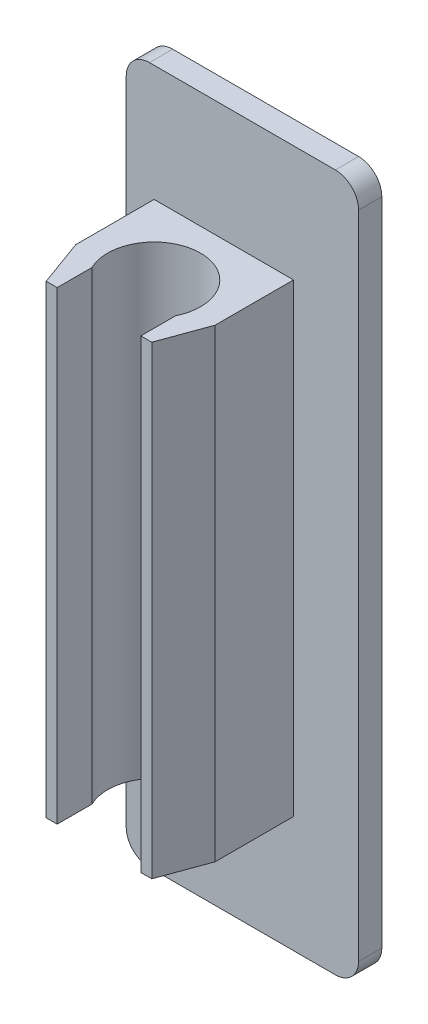
ISO-10303-21;
HEADER;
FILE_DESCRIPTION(('STEP AP214'),'2;1');
FILE_NAME('part.step','',(''),(''),'','','');
FILE_SCHEMA(('AUTOMOTIVE_DESIGN { 1 0 10303 214 1 1 1 1 }'));
ENDSEC;
DATA;
#1=APPLICATION_CONTEXT('core data for automotive mechanical design processes');
#2=APPLICATION_PROTOCOL_DEFINITION('international standard','automotive_design',2000,#1);
#3=PRODUCT_CONTEXT('',#1,'mechanical');
#4=PRODUCT('Part','Part','',(#3));
#5=PRODUCT_RELATED_PRODUCT_CATEGORY('part','',(#4));
#6=PRODUCT_DEFINITION_FORMATION('','',#4);
#7=PRODUCT_DEFINITION_CONTEXT('part definition',#1,'design');
#8=PRODUCT_DEFINITION('design','',#6,#7);
#9=PRODUCT_DEFINITION_SHAPE('','',#8);
#10=(LENGTH_UNIT() NAMED_UNIT(*) SI_UNIT(.MILLI.,.METRE.));
#11=(NAMED_UNIT(*) PLANE_ANGLE_UNIT() SI_UNIT($,.RADIAN.));
#12=(NAMED_UNIT(*) SI_UNIT($,.STERADIAN.) SOLID_ANGLE_UNIT());
#13=UNCERTAINTY_MEASURE_WITH_UNIT(LENGTH_MEASURE(1.E-05),#10,'distance_accuracy_value','');
#14=(GEOMETRIC_REPRESENTATION_CONTEXT(3) GLOBAL_UNCERTAINTY_ASSIGNED_CONTEXT((#13)) GLOBAL_UNIT_ASSIGNED_CONTEXT((#10,
#11,#12)) REPRESENTATION_CONTEXT('',''));
#15=CARTESIAN_POINT('',(0.,0.,0.));
#16=DIRECTION('',(0.,0.,1.));
#17=DIRECTION('',(1.,0.,0.));
#18=AXIS2_PLACEMENT_3D('',#15,#16,#17);
#19=CARTESIAN_POINT('',(0.,0.,1.));
#20=DIRECTION('',(0.,0.,1.));
#21=DIRECTION('',(1.,0.,0.));
#22=AXIS2_PLACEMENT_3D('',#19,#20,#21);
#23=PLANE('',#22);
#24=DIRECTION('',(0.,1.,0.));
#25=VECTOR('',#24,1.);
#26=CARTESIAN_POINT('',(5.,-15.,1.));
#27=LINE('',#26,#25);
#28=CARTESIAN_POINT('',(5.,-14.,1.));
#29=VERTEX_POINT('',#28);
#30=CARTESIAN_POINT('',(5.,14.,1.));
#31=VERTEX_POINT('',#30);
#32=EDGE_CURVE('E204',#29,#31,#27,.T.);
#33=ORIENTED_EDGE('',*,*,#32,.T.);
#34=CARTESIAN_POINT('',(4.,14.,1.));
#35=DIRECTION('',(0.,0.,1.));
#36=DIRECTION('',(1.,0.,0.));
#37=AXIS2_PLACEMENT_3D('',#34,#35,#36);
#38=CIRCLE('',#37,1.);
#39=CARTESIAN_POINT('',(4.,15.,1.));
#40=VERTEX_POINT('',#39);
#41=EDGE_CURVE('E239',#31,#40,#38,.T.);
#42=ORIENTED_EDGE('',*,*,#41,.T.);
#43=DIRECTION('',(-1.,0.,0.));
#44=VECTOR('',#43,1.);
#45=CARTESIAN_POINT('',(5.,15.,1.));
#46=LINE('',#45,#44);
#47=CARTESIAN_POINT('',(-4.,15.,1.));
#48=VERTEX_POINT('',#47);
#49=EDGE_CURVE('E207',#40,#48,#46,.T.);
#50=ORIENTED_EDGE('',*,*,#49,.T.);
#51=CARTESIAN_POINT('',(-4.,14.,1.));
#52=DIRECTION('',(0.,0.,1.));
#53=DIRECTION('',(1.,0.,0.));
#54=AXIS2_PLACEMENT_3D('',#51,#52,#53);
#55=CIRCLE('',#54,1.);
#56=CARTESIAN_POINT('',(-5.,14.,1.));
#57=VERTEX_POINT('',#56);
#58=EDGE_CURVE('E235',#48,#57,#55,.T.);
#59=ORIENTED_EDGE('',*,*,#58,.T.);
#60=DIRECTION('',(0.,-1.,0.));
#61=VECTOR('',#60,1.);
#62=CARTESIAN_POINT('',(-5.,-15.,1.));
#63=LINE('',#62,#61);
#64=CARTESIAN_POINT('',(-5.,-14.,1.));
#65=VERTEX_POINT('',#64);
#66=EDGE_CURVE('E199',#57,#65,#63,.T.);
#67=ORIENTED_EDGE('',*,*,#66,.T.);
#68=CARTESIAN_POINT('',(-4.,-14.,1.));
#69=DIRECTION('',(0.,0.,1.));
#70=DIRECTION('',(1.,0.,0.));
#71=AXIS2_PLACEMENT_3D('',#68,#69,#70);
#72=CIRCLE('',#71,1.);
#73=CARTESIAN_POINT('',(-4.,-15.,1.));
#74=VERTEX_POINT('',#73);
#75=EDGE_CURVE('E59',#65,#74,#72,.T.);
#76=ORIENTED_EDGE('',*,*,#75,.T.);
#77=DIRECTION('',(1.,0.,0.));
#78=VECTOR('',#77,1.);
#79=CARTESIAN_POINT('',(5.,-15.,1.));
#80=LINE('',#79,#78);
#81=CARTESIAN_POINT('',(4.,-15.,1.));
#82=VERTEX_POINT('',#81);
#83=EDGE_CURVE('E201',#74,#82,#80,.T.);
#84=ORIENTED_EDGE('',*,*,#83,.T.);
#85=CARTESIAN_POINT('',(4.,-14.,1.));
#86=DIRECTION('',(0.,0.,1.));
#87=DIRECTION('',(1.,0.,0.));
#88=AXIS2_PLACEMENT_3D('',#85,#86,#87);
#89=CIRCLE('',#88,1.);
#90=EDGE_CURVE('E237',#82,#29,#89,.T.);
#91=ORIENTED_EDGE('',*,*,#90,.T.);
#92=EDGE_LOOP('',(#33,#42,#50,#59,#67,#76,#84,#91));
#93=FACE_BOUND('',#92,.T.);
#94=DIRECTION('',(0.,1.,0.));
#95=VECTOR('',#94,1.);
#96=CARTESIAN_POINT('',(-3.8,-10.,1.));
#97=LINE('',#96,#95);
#98=CARTESIAN_POINT('',(-3.8,-10.,1.));
#99=VERTEX_POINT('',#98);
#100=CARTESIAN_POINT('',(-3.8,10.,1.));
#101=VERTEX_POINT('',#100);
#102=EDGE_CURVE('E172',#99,#101,#97,.T.);
#103=ORIENTED_EDGE('',*,*,#102,.T.);
#104=DIRECTION('',(1.,0.,0.));
#105=VECTOR('',#104,1.);
#106=CARTESIAN_POINT('',(-3.8,10.,1.));
#107=LINE('',#106,#105);
#108=CARTESIAN_POINT('',(2.2,10.,1.));
#109=VERTEX_POINT('',#108);
#110=EDGE_CURVE('E513',#101,#109,#107,.T.);
#111=ORIENTED_EDGE('',*,*,#110,.T.);
#112=DIRECTION('',(0.,1.,0.));
#113=VECTOR('',#112,1.);
#114=CARTESIAN_POINT('',(2.2,-10.,1.));
#115=LINE('',#114,#113);
#116=CARTESIAN_POINT('',(2.2,-10.,1.));
#117=VERTEX_POINT('',#116);
#118=EDGE_CURVE('E195',#117,#109,#115,.T.);
#119=ORIENTED_EDGE('',*,*,#118,.F.);
#120=DIRECTION('',(1.,0.,0.));
#121=VECTOR('',#120,1.);
#122=CARTESIAN_POINT('',(-3.8,-10.,1.));
#123=LINE('',#122,#121);
#124=EDGE_CURVE('E175',#99,#117,#123,.T.);
#125=ORIENTED_EDGE('',*,*,#124,.F.);
#126=EDGE_LOOP('',(#103,#111,#119,#125));
#127=FACE_BOUND('',#126,.T.);
#128=ADVANCED_FACE('F37',(#93,#127),#23,.T.);
#129=CARTESIAN_POINT('',(-5.,-15.,1.));
#130=DIRECTION('',(1.,0.,0.));
#131=DIRECTION('',(0.,0.,-1.));
#132=AXIS2_PLACEMENT_3D('',#129,#130,#131);
#133=PLANE('',#132);
#134=ORIENTED_EDGE('',*,*,#66,.F.);
#135=DIRECTION('',(0.,0.,-1.));
#136=VECTOR('',#135,1.);
#137=CARTESIAN_POINT('',(-5.,14.,1.));
#138=LINE('',#137,#136);
#139=CARTESIAN_POINT('',(-5.,14.,0.));
#140=VERTEX_POINT('',#139);
#141=EDGE_CURVE('E11',#57,#140,#138,.T.);
#142=ORIENTED_EDGE('',*,*,#141,.T.);
#143=DIRECTION('',(0.,-1.,0.));
#144=VECTOR('',#143,1.);
#145=CARTESIAN_POINT('',(-5.,-15.,0.));
#146=LINE('',#145,#144);
#147=CARTESIAN_POINT('',(-5.,-14.,0.));
#148=VERTEX_POINT('',#147);
#149=EDGE_CURVE('E190',#140,#148,#146,.T.);
#150=ORIENTED_EDGE('',*,*,#149,.T.);
#151=DIRECTION('',(0.,0.,-1.));
#152=VECTOR('',#151,1.);
#153=CARTESIAN_POINT('',(-5.,-14.,1.));
#154=LINE('',#153,#152);
#155=EDGE_CURVE('E45',#148,#65,#154,.F.);
#156=ORIENTED_EDGE('',*,*,#155,.T.);
#157=EDGE_LOOP('',(#134,#142,#150,#156));
#158=FACE_BOUND('',#157,.T.);
#159=ADVANCED_FACE('F247',(#158),#133,.F.);
#160=CARTESIAN_POINT('',(5.,-15.,1.));
#161=DIRECTION('',(0.,1.,0.));
#162=DIRECTION('',(-1.,0.,0.));
#163=AXIS2_PLACEMENT_3D('',#160,#161,#162);
#164=PLANE('',#163);
#165=DIRECTION('',(1.,0.,0.));
#166=VECTOR('',#165,1.);
#167=CARTESIAN_POINT('',(5.,-15.,0.));
#168=LINE('',#167,#166);
#169=CARTESIAN_POINT('',(-4.,-15.,0.));
#170=VERTEX_POINT('',#169);
#171=CARTESIAN_POINT('',(4.,-15.,0.));
#172=VERTEX_POINT('',#171);
#173=EDGE_CURVE('E193',#170,#172,#168,.T.);
#174=ORIENTED_EDGE('',*,*,#173,.T.);
#175=DIRECTION('',(0.,0.,-1.));
#176=VECTOR('',#175,1.);
#177=CARTESIAN_POINT('',(4.,-15.,1.));
#178=LINE('',#177,#176);
#179=EDGE_CURVE('E52',#172,#82,#178,.F.);
#180=ORIENTED_EDGE('',*,*,#179,.T.);
#181=ORIENTED_EDGE('',*,*,#83,.F.);
#182=DIRECTION('',(0.,0.,-1.));
#183=VECTOR('',#182,1.);
#184=CARTESIAN_POINT('',(-4.,-15.,1.));
#185=LINE('',#184,#183);
#186=EDGE_CURVE('E241',#74,#170,#185,.T.);
#187=ORIENTED_EDGE('',*,*,#186,.T.);
#188=EDGE_LOOP('',(#174,#180,#181,#187));
#189=FACE_BOUND('',#188,.T.);
#190=ADVANCED_FACE('F255',(#189),#164,.F.);
#191=CARTESIAN_POINT('',(5.,-15.,1.));
#192=DIRECTION('',(-1.,0.,0.));
#193=DIRECTION('',(0.,0.,1.));
#194=AXIS2_PLACEMENT_3D('',#191,#192,#193);
#195=PLANE('',#194);
#196=DIRECTION('',(0.,1.,0.));
#197=VECTOR('',#196,1.);
#198=CARTESIAN_POINT('',(5.,-15.,0.));
#199=LINE('',#198,#197);
#200=CARTESIAN_POINT('',(5.,-14.,0.));
#201=VERTEX_POINT('',#200);
#202=CARTESIAN_POINT('',(5.,14.,0.));
#203=VERTEX_POINT('',#202);
#204=EDGE_CURVE('E212',#201,#203,#199,.T.);
#205=ORIENTED_EDGE('',*,*,#204,.T.);
#206=DIRECTION('',(0.,0.,-1.));
#207=VECTOR('',#206,1.);
#208=CARTESIAN_POINT('',(5.,14.,1.));
#209=LINE('',#208,#207);
#210=EDGE_CURVE('E232',#203,#31,#209,.F.);
#211=ORIENTED_EDGE('',*,*,#210,.T.);
#212=ORIENTED_EDGE('',*,*,#32,.F.);
#213=DIRECTION('',(0.,0.,-1.));
#214=VECTOR('',#213,1.);
#215=CARTESIAN_POINT('',(5.,-14.,1.));
#216=LINE('',#215,#214);
#217=EDGE_CURVE('E229',#29,#201,#216,.T.);
#218=ORIENTED_EDGE('',*,*,#217,.T.);
#219=EDGE_LOOP('',(#205,#211,#212,#218));
#220=FACE_BOUND('',#219,.T.);
#221=ADVANCED_FACE('F266',(#220),#195,.F.);
#222=CARTESIAN_POINT('',(5.,15.,1.));
#223=DIRECTION('',(0.,-1.,0.));
#224=DIRECTION('',(1.,0.,0.));
#225=AXIS2_PLACEMENT_3D('',#222,#223,#224);
#226=PLANE('',#225);
#227=ORIENTED_EDGE('',*,*,#49,.F.);
#228=DIRECTION('',(0.,0.,-1.));
#229=VECTOR('',#228,1.);
#230=CARTESIAN_POINT('',(4.,15.,1.));
#231=LINE('',#230,#229);
#232=CARTESIAN_POINT('',(4.,15.,0.));
#233=VERTEX_POINT('',#232);
#234=EDGE_CURVE('E218',#40,#233,#231,.T.);
#235=ORIENTED_EDGE('',*,*,#234,.T.);
#236=DIRECTION('',(-1.,0.,0.));
#237=VECTOR('',#236,1.);
#238=CARTESIAN_POINT('',(5.,15.,0.));
#239=LINE('',#238,#237);
#240=CARTESIAN_POINT('',(-4.,15.,0.));
#241=VERTEX_POINT('',#240);
#242=EDGE_CURVE('E202',#233,#241,#239,.T.);
#243=ORIENTED_EDGE('',*,*,#242,.T.);
#244=DIRECTION('',(0.,0.,-1.));
#245=VECTOR('',#244,1.);
#246=CARTESIAN_POINT('',(-4.,15.,1.));
#247=LINE('',#246,#245);
#248=EDGE_CURVE('E209',#241,#48,#247,.F.);
#249=ORIENTED_EDGE('',*,*,#248,.T.);
#250=EDGE_LOOP('',(#227,#235,#243,#249));
#251=FACE_BOUND('',#250,.T.);
#252=ADVANCED_FACE('F274',(#251),#226,.F.);
#253=CARTESIAN_POINT('',(0.,0.,0.));
#254=DIRECTION('',(0.,0.,1.));
#255=DIRECTION('',(1.,0.,0.));
#256=AXIS2_PLACEMENT_3D('',#253,#254,#255);
#257=PLANE('',#256);
#258=ORIENTED_EDGE('',*,*,#242,.F.);
#259=CARTESIAN_POINT('',(4.,14.,0.));
#260=DIRECTION('',(0.,0.,1.));
#261=DIRECTION('',(1.,0.,0.));
#262=AXIS2_PLACEMENT_3D('',#259,#260,#261);
#263=CIRCLE('',#262,1.);
#264=EDGE_CURVE('E227',#233,#203,#263,.F.);
#265=ORIENTED_EDGE('',*,*,#264,.T.);
#266=ORIENTED_EDGE('',*,*,#204,.F.);
#267=CARTESIAN_POINT('',(4.,-14.,0.));
#268=DIRECTION('',(0.,0.,1.));
#269=DIRECTION('',(1.,0.,0.));
#270=AXIS2_PLACEMENT_3D('',#267,#268,#269);
#271=CIRCLE('',#270,1.);
#272=EDGE_CURVE('E225',#201,#172,#271,.F.);
#273=ORIENTED_EDGE('',*,*,#272,.T.);
#274=ORIENTED_EDGE('',*,*,#173,.F.);
#275=CARTESIAN_POINT('',(-4.,-14.,0.));
#276=DIRECTION('',(0.,0.,1.));
#277=DIRECTION('',(1.,0.,0.));
#278=AXIS2_PLACEMENT_3D('',#275,#276,#277);
#279=CIRCLE('',#278,1.);
#280=EDGE_CURVE('E221',#170,#148,#279,.F.);
#281=ORIENTED_EDGE('',*,*,#280,.T.);
#282=ORIENTED_EDGE('',*,*,#149,.F.);
#283=CARTESIAN_POINT('',(-4.,14.,0.));
#284=DIRECTION('',(0.,0.,1.));
#285=DIRECTION('',(1.,0.,0.));
#286=AXIS2_PLACEMENT_3D('',#283,#284,#285);
#287=CIRCLE('',#286,1.);
#288=EDGE_CURVE('E223',#140,#241,#287,.F.);
#289=ORIENTED_EDGE('',*,*,#288,.T.);
#290=EDGE_LOOP('',(#258,#265,#266,#273,#274,#281,#282,#289));
#291=FACE_BOUND('',#290,.T.);
#292=ADVANCED_FACE('F258',(#291),#257,.F.);
#293=CARTESIAN_POINT('',(-3.8,-10.,4.37177978870814));
#294=DIRECTION('',(0.939692620785908,0.,-0.342020143325669));
#295=DIRECTION('',(-0.342020143325669,0.,-0.939692620785908));
#296=AXIS2_PLACEMENT_3D('',#293,#294,#295);
#297=PLANE('',#296);
#298=DIRECTION('',(-0.342020143325669,0.,-0.939692620785908));
#299=VECTOR('',#298,1.);
#300=CARTESIAN_POINT('',(-3.8,10.,4.37177978870814));
#301=LINE('',#300,#299);
#302=CARTESIAN_POINT('',(-3.07205953146759,10.,6.37177978870814));
#303=VERTEX_POINT('',#302);
#304=CARTESIAN_POINT('',(-3.8,10.,4.37177978870814));
#305=VERTEX_POINT('',#304);
#306=EDGE_CURVE('E189',#303,#305,#301,.T.);
#307=ORIENTED_EDGE('',*,*,#306,.T.);
#308=DIRECTION('',(0.,1.,0.));
#309=VECTOR('',#308,1.);
#310=CARTESIAN_POINT('',(-3.8,-10.,4.37177978870814));
#311=LINE('',#310,#309);
#312=CARTESIAN_POINT('',(-3.8,-10.,4.37177978870814));
#313=VERTEX_POINT('',#312);
#314=EDGE_CURVE('E169',#313,#305,#311,.T.);
#315=ORIENTED_EDGE('',*,*,#314,.F.);
#316=DIRECTION('',(-0.342020143325669,0.,-0.939692620785908));
#317=VECTOR('',#316,1.);
#318=CARTESIAN_POINT('',(-3.8,-10.,4.37177978870814));
#319=LINE('',#318,#317);
#320=CARTESIAN_POINT('',(-3.07205953146759,-10.,6.37177978870814));
#321=VERTEX_POINT('',#320);
#322=EDGE_CURVE('E176',#321,#313,#319,.T.);
#323=ORIENTED_EDGE('',*,*,#322,.F.);
#324=DIRECTION('',(0.,1.,0.));
#325=VECTOR('',#324,1.);
#326=CARTESIAN_POINT('',(-3.07205953146759,-10.,6.37177978870814));
#327=LINE('',#326,#325);
#328=EDGE_CURVE('E534',#321,#303,#327,.T.);
#329=ORIENTED_EDGE('',*,*,#328,.T.);
#330=EDGE_LOOP('',(#307,#315,#323,#329));
#331=FACE_BOUND('',#330,.T.);
#332=ADVANCED_FACE('F187',(#331),#297,.F.);
#333=CARTESIAN_POINT('',(-3.8,-10.,1.));
#334=DIRECTION('',(1.,0.,0.));
#335=DIRECTION('',(0.,0.,-1.));
#336=AXIS2_PLACEMENT_3D('',#333,#334,#335);
#337=PLANE('',#336);
#338=DIRECTION('',(0.,0.,-1.));
#339=VECTOR('',#338,1.);
#340=CARTESIAN_POINT('',(-3.8,10.,1.));
#341=LINE('',#340,#339);
#342=EDGE_CURVE('E565',#305,#101,#341,.T.);
#343=ORIENTED_EDGE('',*,*,#342,.T.);
#344=ORIENTED_EDGE('',*,*,#102,.F.);
#345=DIRECTION('',(0.,0.,-1.));
#346=VECTOR('',#345,1.);
#347=CARTESIAN_POINT('',(-3.8,-10.,1.));
#348=LINE('',#347,#346);
#349=EDGE_CURVE('E164',#313,#99,#348,.T.);
#350=ORIENTED_EDGE('',*,*,#349,.F.);
#351=ORIENTED_EDGE('',*,*,#314,.T.);
#352=EDGE_LOOP('',(#343,#344,#350,#351));
#353=FACE_BOUND('',#352,.T.);
#354=ADVANCED_FACE('F167',(#353),#337,.F.);
#355=CARTESIAN_POINT('',(2.2,-10.,1.));
#356=DIRECTION('',(-1.,0.,0.));
#357=DIRECTION('',(0.,0.,1.));
#358=AXIS2_PLACEMENT_3D('',#355,#356,#357);
#359=PLANE('',#358);
#360=DIRECTION('',(0.,0.,1.));
#361=VECTOR('',#360,1.);
#362=CARTESIAN_POINT('',(2.2,10.,1.));
#363=LINE('',#362,#361);
#364=CARTESIAN_POINT('',(2.2,10.,4.37177978870814));
#365=VERTEX_POINT('',#364);
#366=EDGE_CURVE('E504',#109,#365,#363,.T.);
#367=ORIENTED_EDGE('',*,*,#366,.T.);
#368=DIRECTION('',(0.,1.,0.));
#369=VECTOR('',#368,1.);
#370=CARTESIAN_POINT('',(2.2,-10.,4.37177978870814));
#371=LINE('',#370,#369);
#372=CARTESIAN_POINT('',(2.2,-10.,4.37177978870814));
#373=VERTEX_POINT('',#372);
#374=EDGE_CURVE('E507',#373,#365,#371,.T.);
#375=ORIENTED_EDGE('',*,*,#374,.F.);
#376=DIRECTION('',(0.,0.,1.));
#377=VECTOR('',#376,1.);
#378=CARTESIAN_POINT('',(2.2,-10.,1.));
#379=LINE('',#378,#377);
#380=EDGE_CURVE('E556',#117,#373,#379,.T.);
#381=ORIENTED_EDGE('',*,*,#380,.F.);
#382=ORIENTED_EDGE('',*,*,#118,.T.);
#383=EDGE_LOOP('',(#367,#375,#381,#382));
#384=FACE_BOUND('',#383,.T.);
#385=ADVANCED_FACE('F336',(#384),#359,.F.);
#386=CARTESIAN_POINT('',(2.2,-10.,4.37177978870814));
#387=DIRECTION('',(-0.939692620785908,0.,-0.34202014332567));
#388=DIRECTION('',(-0.34202014332567,0.,0.939692620785908));
#389=AXIS2_PLACEMENT_3D('',#386,#387,#388);
#390=PLANE('',#389);
#391=DIRECTION('',(-0.34202014332567,0.,0.939692620785908));
#392=VECTOR('',#391,1.);
#393=CARTESIAN_POINT('',(2.2,10.,4.37177978870814));
#394=LINE('',#393,#392);
#395=CARTESIAN_POINT('',(1.47205953146759,10.,6.37177978870814));
#396=VERTEX_POINT('',#395);
#397=EDGE_CURVE('E512',#365,#396,#394,.T.);
#398=ORIENTED_EDGE('',*,*,#397,.T.);
#399=DIRECTION('',(0.,1.,0.));
#400=VECTOR('',#399,1.);
#401=CARTESIAN_POINT('',(1.47205953146759,-10.,6.37177978870814));
#402=LINE('',#401,#400);
#403=CARTESIAN_POINT('',(1.47205953146759,-10.,6.37177978870814));
#404=VERTEX_POINT('',#403);
#405=EDGE_CURVE('E518',#404,#396,#402,.T.);
#406=ORIENTED_EDGE('',*,*,#405,.F.);
#407=DIRECTION('',(-0.34202014332567,0.,0.939692620785908));
#408=VECTOR('',#407,1.);
#409=CARTESIAN_POINT('',(2.2,-10.,4.37177978870814));
#410=LINE('',#409,#408);
#411=EDGE_CURVE('E517',#373,#404,#410,.T.);
#412=ORIENTED_EDGE('',*,*,#411,.F.);
#413=ORIENTED_EDGE('',*,*,#374,.T.);
#414=EDGE_LOOP('',(#398,#406,#412,#413));
#415=FACE_BOUND('',#414,.T.);
#416=ADVANCED_FACE('F332',(#415),#390,.F.);
#417=CARTESIAN_POINT('',(1.47205953146759,-10.,6.37177978870814));
#418=DIRECTION('',(0.,0.,-1.));
#419=DIRECTION('',(-1.,0.,0.));
#420=AXIS2_PLACEMENT_3D('',#417,#418,#419);
#421=PLANE('',#420);
#422=DIRECTION('',(-1.,0.,0.));
#423=VECTOR('',#422,1.);
#424=CARTESIAN_POINT('',(1.47205953146759,10.,6.37177978870814));
#425=LINE('',#424,#423);
#426=CARTESIAN_POINT('',(0.999999999999999,10.,6.37177978870814));
#427=VERTEX_POINT('',#426);
#428=EDGE_CURVE('E522',#396,#427,#425,.T.);
#429=ORIENTED_EDGE('',*,*,#428,.T.);
#430=DIRECTION('',(0.,1.,0.));
#431=VECTOR('',#430,1.);
#432=CARTESIAN_POINT('',(0.999999999999999,-10.,6.37177978870814));
#433=LINE('',#432,#431);
#434=CARTESIAN_POINT('',(0.999999999999999,-10.,6.37177978870814));
#435=VERTEX_POINT('',#434);
#436=EDGE_CURVE('E545',#435,#427,#433,.T.);
#437=ORIENTED_EDGE('',*,*,#436,.F.);
#438=DIRECTION('',(-1.,0.,0.));
#439=VECTOR('',#438,1.);
#440=CARTESIAN_POINT('',(1.47205953146759,-10.,6.37177978870814));
#441=LINE('',#440,#439);
#442=EDGE_CURVE('E550',#404,#435,#441,.T.);
#443=ORIENTED_EDGE('',*,*,#442,.F.);
#444=ORIENTED_EDGE('',*,*,#405,.T.);
#445=EDGE_LOOP('',(#429,#437,#443,#444));
#446=FACE_BOUND('',#445,.T.);
#447=ADVANCED_FACE('F328',(#446),#421,.F.);
#448=CARTESIAN_POINT('',(0.999999999999999,-10.,6.37177978870814));
#449=DIRECTION('',(1.,0.,0.));
#450=DIRECTION('',(0.,0.,-1.));
#451=AXIS2_PLACEMENT_3D('',#448,#449,#450);
#452=PLANE('',#451);
#453=DIRECTION('',(0.,0.,-1.));
#454=VECTOR('',#453,1.);
#455=CARTESIAN_POINT('',(0.999999999999999,10.,6.37177978870814));
#456=LINE('',#455,#454);
#457=CARTESIAN_POINT('',(1.,10.,4.87177978870814));
#458=VERTEX_POINT('',#457);
#459=EDGE_CURVE('E524',#427,#458,#456,.T.);
#460=ORIENTED_EDGE('',*,*,#459,.T.);
#461=DIRECTION('',(0.,1.,0.));
#462=VECTOR('',#461,1.);
#463=CARTESIAN_POINT('',(1.,-10.,4.87177978870814));
#464=LINE('',#463,#462);
#465=CARTESIAN_POINT('',(1.,-10.,4.87177978870814));
#466=VERTEX_POINT('',#465);
#467=EDGE_CURVE('E542',#466,#458,#464,.T.);
#468=ORIENTED_EDGE('',*,*,#467,.F.);
#469=DIRECTION('',(0.,0.,-1.));
#470=VECTOR('',#469,1.);
#471=CARTESIAN_POINT('',(0.999999999999999,-10.,6.37177978870814));
#472=LINE('',#471,#470);
#473=EDGE_CURVE('E552',#435,#466,#472,.T.);
#474=ORIENTED_EDGE('',*,*,#473,.F.);
#475=ORIENTED_EDGE('',*,*,#436,.T.);
#476=EDGE_LOOP('',(#460,#468,#474,#475));
#477=FACE_BOUND('',#476,.T.);
#478=ADVANCED_FACE('F324',(#477),#452,.F.);
#479=CARTESIAN_POINT('',(-0.800000000000001,-10.,4.));
#480=DIRECTION('',(0.,1.,0.));
#481=DIRECTION('',(0.,0.,1.));
#482=AXIS2_PLACEMENT_3D('',#479,#480,#481);
#483=CYLINDRICAL_SURFACE('',#482,2.);
#484=CARTESIAN_POINT('',(-0.800000000000001,10.,4.));
#485=DIRECTION('',(0.,1.,0.));
#486=DIRECTION('',(0.,0.,-1.));
#487=AXIS2_PLACEMENT_3D('',#484,#485,#486);
#488=CIRCLE('',#487,2.);
#489=CARTESIAN_POINT('',(-2.6,10.,4.87177978870814));
#490=VERTEX_POINT('',#489);
#491=EDGE_CURVE('E529',#458,#490,#488,.T.);
#492=ORIENTED_EDGE('',*,*,#491,.T.);
#493=DIRECTION('',(0.,1.,0.));
#494=VECTOR('',#493,1.);
#495=CARTESIAN_POINT('',(-2.6,-10.,4.87177978870814));
#496=LINE('',#495,#494);
#497=CARTESIAN_POINT('',(-2.6,-10.,4.87177978870814));
#498=VERTEX_POINT('',#497);
#499=EDGE_CURVE('E539',#498,#490,#496,.T.);
#500=ORIENTED_EDGE('',*,*,#499,.F.);
#501=CARTESIAN_POINT('',(-0.800000000000001,-10.,4.));
#502=DIRECTION('',(0.,1.,0.));
#503=DIRECTION('',(0.,0.,-1.));
#504=AXIS2_PLACEMENT_3D('',#501,#502,#503);
#505=CIRCLE('',#504,2.);
#506=EDGE_CURVE('E554',#466,#498,#505,.T.);
#507=ORIENTED_EDGE('',*,*,#506,.F.);
#508=ORIENTED_EDGE('',*,*,#467,.T.);
#509=EDGE_LOOP('',(#492,#500,#507,#508));
#510=FACE_BOUND('',#509,.T.);
#511=ADVANCED_FACE('F320',(#510),#483,.F.);
#512=CARTESIAN_POINT('',(-2.6,-10.,6.37177978870813));
#513=DIRECTION('',(-1.,0.,0.));
#514=DIRECTION('',(0.,0.,1.));
#515=AXIS2_PLACEMENT_3D('',#512,#513,#514);
#516=PLANE('',#515);
#517=DIRECTION('',(0.,0.,1.));
#518=VECTOR('',#517,1.);
#519=CARTESIAN_POINT('',(-2.6,10.,6.37177978870813));
#520=LINE('',#519,#518);
#521=CARTESIAN_POINT('',(-2.6,10.,6.37177978870813));
#522=VERTEX_POINT('',#521);
#523=EDGE_CURVE('E531',#490,#522,#520,.T.);
#524=ORIENTED_EDGE('',*,*,#523,.T.);
#525=DIRECTION('',(0.,1.,0.));
#526=VECTOR('',#525,1.);
#527=CARTESIAN_POINT('',(-2.6,-10.,6.37177978870813));
#528=LINE('',#527,#526);
#529=CARTESIAN_POINT('',(-2.6,-10.,6.37177978870813));
#530=VERTEX_POINT('',#529);
#531=EDGE_CURVE('E536',#530,#522,#528,.T.);
#532=ORIENTED_EDGE('',*,*,#531,.F.);
#533=DIRECTION('',(0.,0.,1.));
#534=VECTOR('',#533,1.);
#535=CARTESIAN_POINT('',(-2.6,-10.,6.37177978870813));
#536=LINE('',#535,#534);
#537=EDGE_CURVE('E561',#498,#530,#536,.T.);
#538=ORIENTED_EDGE('',*,*,#537,.F.);
#539=ORIENTED_EDGE('',*,*,#499,.T.);
#540=EDGE_LOOP('',(#524,#532,#538,#539));
#541=FACE_BOUND('',#540,.T.);
#542=ADVANCED_FACE('F316',(#541),#516,.F.);
#543=CARTESIAN_POINT('',(-3.07205953146759,-10.,6.37177978870814));
#544=DIRECTION('',(0.,0.,-1.));
#545=DIRECTION('',(-1.,0.,0.));
#546=AXIS2_PLACEMENT_3D('',#543,#544,#545);
#547=PLANE('',#546);
#548=DIRECTION('',(-1.,0.,0.));
#549=VECTOR('',#548,1.);
#550=CARTESIAN_POINT('',(-3.07205953146759,10.,6.37177978870814));
#551=LINE('',#550,#549);
#552=EDGE_CURVE('E185',#522,#303,#551,.T.);
#553=ORIENTED_EDGE('',*,*,#552,.T.);
#554=ORIENTED_EDGE('',*,*,#328,.F.);
#555=DIRECTION('',(-1.,0.,0.));
#556=VECTOR('',#555,1.);
#557=CARTESIAN_POINT('',(-3.07205953146759,-10.,6.37177978870814));
#558=LINE('',#557,#556);
#559=EDGE_CURVE('E181',#530,#321,#558,.T.);
#560=ORIENTED_EDGE('',*,*,#559,.F.);
#561=ORIENTED_EDGE('',*,*,#531,.T.);
#562=EDGE_LOOP('',(#553,#554,#560,#561));
#563=FACE_BOUND('',#562,.T.);
#564=ADVANCED_FACE('F311',(#563),#547,.F.);
#565=CARTESIAN_POINT('',(-0.800000000000001,-10.,4.));
#566=DIRECTION('',(0.,-1.,0.));
#567=DIRECTION('',(0.,0.,-1.));
#568=AXIS2_PLACEMENT_3D('',#565,#566,#567);
#569=PLANE('',#568);
#570=ORIENTED_EDGE('',*,*,#322,.T.);
#571=ORIENTED_EDGE('',*,*,#349,.T.);
#572=ORIENTED_EDGE('',*,*,#124,.T.);
#573=ORIENTED_EDGE('',*,*,#380,.T.);
#574=ORIENTED_EDGE('',*,*,#411,.T.);
#575=ORIENTED_EDGE('',*,*,#442,.T.);
#576=ORIENTED_EDGE('',*,*,#473,.T.);
#577=ORIENTED_EDGE('',*,*,#506,.T.);
#578=ORIENTED_EDGE('',*,*,#537,.T.);
#579=ORIENTED_EDGE('',*,*,#559,.T.);
#580=EDGE_LOOP('',(#570,#571,#572,#573,#574,#575,#576,#577,#578,#579));
#581=FACE_BOUND('',#580,.T.);
#582=ADVANCED_FACE('F179',(#581),#569,.T.);
#583=CARTESIAN_POINT('',(-0.800000000000001,10.,4.));
#584=DIRECTION('',(0.,-1.,0.));
#585=DIRECTION('',(0.,0.,-1.));
#586=AXIS2_PLACEMENT_3D('',#583,#584,#585);
#587=PLANE('',#586);
#588=ORIENTED_EDGE('',*,*,#306,.F.);
#589=ORIENTED_EDGE('',*,*,#552,.F.);
#590=ORIENTED_EDGE('',*,*,#523,.F.);
#591=ORIENTED_EDGE('',*,*,#491,.F.);
#592=ORIENTED_EDGE('',*,*,#459,.F.);
#593=ORIENTED_EDGE('',*,*,#428,.F.);
#594=ORIENTED_EDGE('',*,*,#397,.F.);
#595=ORIENTED_EDGE('',*,*,#366,.F.);
#596=ORIENTED_EDGE('',*,*,#110,.F.);
#597=ORIENTED_EDGE('',*,*,#342,.F.);
#598=EDGE_LOOP('',(#588,#589,#590,#591,#592,#593,#594,#595,#596,#597));
#599=FACE_BOUND('',#598,.T.);
#600=ADVANCED_FACE('F302',(#599),#587,.F.);
#601=CARTESIAN_POINT('',(4.,14.,1.));
#602=DIRECTION('',(0.,0.,-1.));
#603=DIRECTION('',(-1.,0.,0.));
#604=AXIS2_PLACEMENT_3D('',#601,#602,#603);
#605=CYLINDRICAL_SURFACE('',#604,1.);
#606=ORIENTED_EDGE('',*,*,#41,.F.);
#607=ORIENTED_EDGE('',*,*,#210,.F.);
#608=ORIENTED_EDGE('',*,*,#264,.F.);
#609=ORIENTED_EDGE('',*,*,#234,.F.);
#610=EDGE_LOOP('',(#606,#607,#608,#609));
#611=FACE_BOUND('',#610,.T.);
#612=ADVANCED_FACE('F272',(#611),#605,.T.);
#613=CARTESIAN_POINT('',(4.,-14.,1.));
#614=DIRECTION('',(0.,0.,-1.));
#615=DIRECTION('',(-1.,0.,0.));
#616=AXIS2_PLACEMENT_3D('',#613,#614,#615);
#617=CYLINDRICAL_SURFACE('',#616,1.);
#618=ORIENTED_EDGE('',*,*,#90,.F.);
#619=ORIENTED_EDGE('',*,*,#179,.F.);
#620=ORIENTED_EDGE('',*,*,#272,.F.);
#621=ORIENTED_EDGE('',*,*,#217,.F.);
#622=EDGE_LOOP('',(#618,#619,#620,#621));
#623=FACE_BOUND('',#622,.T.);
#624=ADVANCED_FACE('F263',(#623),#617,.T.);
#625=CARTESIAN_POINT('',(-4.,14.,1.));
#626=DIRECTION('',(0.,0.,-1.));
#627=DIRECTION('',(-1.,0.,0.));
#628=AXIS2_PLACEMENT_3D('',#625,#626,#627);
#629=CYLINDRICAL_SURFACE('',#628,1.);
#630=ORIENTED_EDGE('',*,*,#58,.F.);
#631=ORIENTED_EDGE('',*,*,#248,.F.);
#632=ORIENTED_EDGE('',*,*,#288,.F.);
#633=ORIENTED_EDGE('',*,*,#141,.F.);
#634=EDGE_LOOP('',(#630,#631,#632,#633));
#635=FACE_BOUND('',#634,.T.);
#636=ADVANCED_FACE('F277',(#635),#629,.T.);
#637=CARTESIAN_POINT('',(-4.,-14.,1.));
#638=DIRECTION('',(0.,0.,-1.));
#639=DIRECTION('',(-1.,0.,0.));
#640=AXIS2_PLACEMENT_3D('',#637,#638,#639);
#641=CYLINDRICAL_SURFACE('',#640,1.);
#642=ORIENTED_EDGE('',*,*,#75,.F.);
#643=ORIENTED_EDGE('',*,*,#155,.F.);
#644=ORIENTED_EDGE('',*,*,#280,.F.);
#645=ORIENTED_EDGE('',*,*,#186,.F.);
#646=EDGE_LOOP('',(#642,#643,#644,#645));
#647=FACE_BOUND('',#646,.T.);
#648=ADVANCED_FACE('F39',(#647),#641,.T.);
#649=CLOSED_SHELL('',(#128,#159,#190,#221,#252,#292,#332,#354,#385,#416,#447,#478,#511,#542,
#564,#582,#600,#612,#624,#636,#648));
#650=MANIFOLD_SOLID_BREP('B2',#649);
#651=ADVANCED_BREP_SHAPE_REPRESENTATION('',(#18,#650),#14);
#652=SHAPE_DEFINITION_REPRESENTATION(#9,#651);
ENDSEC;
END-ISO-10303-21;
